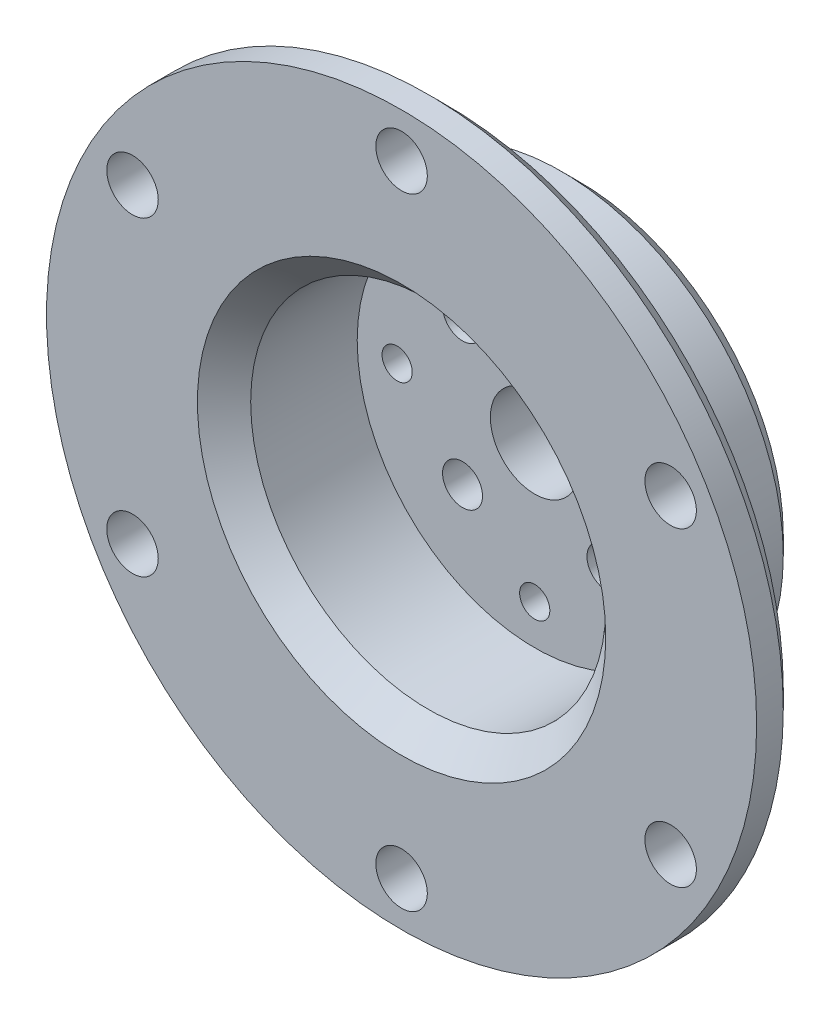
ISO-10303-21;
HEADER;
FILE_DESCRIPTION(('STEP AP214'),'2;1');
FILE_NAME('part.step','',(''),(''),'','','');
FILE_SCHEMA(('AUTOMOTIVE_DESIGN { 1 0 10303 214 1 1 1 1 }'));
ENDSEC;
DATA;
#1=APPLICATION_CONTEXT('core data for automotive mechanical design processes');
#2=APPLICATION_PROTOCOL_DEFINITION('international standard','automotive_design',2000,#1);
#3=PRODUCT_CONTEXT('',#1,'mechanical');
#4=PRODUCT('Part','Part','',(#3));
#5=PRODUCT_RELATED_PRODUCT_CATEGORY('part','',(#4));
#6=PRODUCT_DEFINITION_FORMATION('','',#4);
#7=PRODUCT_DEFINITION_CONTEXT('part definition',#1,'design');
#8=PRODUCT_DEFINITION('design','',#6,#7);
#9=PRODUCT_DEFINITION_SHAPE('','',#8);
#10=(LENGTH_UNIT() NAMED_UNIT(*) SI_UNIT(.MILLI.,.METRE.));
#11=(NAMED_UNIT(*) PLANE_ANGLE_UNIT() SI_UNIT($,.RADIAN.));
#12=(NAMED_UNIT(*) SI_UNIT($,.STERADIAN.) SOLID_ANGLE_UNIT());
#13=UNCERTAINTY_MEASURE_WITH_UNIT(LENGTH_MEASURE(1.E-05),#10,'distance_accuracy_value','');
#14=(GEOMETRIC_REPRESENTATION_CONTEXT(3) GLOBAL_UNCERTAINTY_ASSIGNED_CONTEXT((#13)) GLOBAL_UNIT_ASSIGNED_CONTEXT((#10,
#11,#12)) REPRESENTATION_CONTEXT('',''));
#15=CARTESIAN_POINT('',(0.,0.,0.));
#16=DIRECTION('',(0.,0.,1.));
#17=DIRECTION('',(1.,0.,0.));
#18=AXIS2_PLACEMENT_3D('',#15,#16,#17);
#19=CARTESIAN_POINT('',(0.,0.,5.));
#20=DIRECTION('',(0.,0.,1.));
#21=DIRECTION('',(1.,0.,0.));
#22=AXIS2_PLACEMENT_3D('',#19,#20,#21);
#23=PLANE('',#22);
#24=CARTESIAN_POINT('',(0.,0.,5.));
#25=DIRECTION('',(0.,0.,1.));
#26=DIRECTION('',(1.,0.,0.));
#27=AXIS2_PLACEMENT_3D('',#24,#25,#26);
#28=CIRCLE('',#27,20.);
#29=CARTESIAN_POINT('',(20.,0.,5.));
#30=VERTEX_POINT('',#29);
#31=EDGE_CURVE('E123',#30,#30,#28,.T.);
#32=ORIENTED_EDGE('',*,*,#31,.T.);
#33=EDGE_LOOP('',(#32));
#34=FACE_BOUND('',#33,.T.);
#35=CARTESIAN_POINT('',(8.1317279836453,8.13172798364529,5.));
#36=DIRECTION('',(0.,0.,1.));
#37=DIRECTION('',(1.,0.,0.));
#38=AXIS2_PLACEMENT_3D('',#35,#36,#37);
#39=CIRCLE('',#38,2.25);
#40=CARTESIAN_POINT('',(10.3817279836453,8.13172798364529,5.));
#41=VERTEX_POINT('',#40);
#42=EDGE_CURVE('E99',#41,#41,#39,.F.);
#43=ORIENTED_EDGE('',*,*,#42,.T.);
#44=EDGE_LOOP('',(#43));
#45=FACE_BOUND('',#44,.T.);
#46=CARTESIAN_POINT('',(15.5,0.,5.));
#47=DIRECTION('',(0.,0.,1.));
#48=DIRECTION('',(1.,0.,0.));
#49=AXIS2_PLACEMENT_3D('',#46,#47,#48);
#50=CIRCLE('',#49,1.7);
#51=CARTESIAN_POINT('',(17.2,0.,5.));
#52=VERTEX_POINT('',#51);
#53=EDGE_CURVE('E86',#52,#52,#50,.F.);
#54=ORIENTED_EDGE('',*,*,#53,.T.);
#55=EDGE_LOOP('',(#54));
#56=FACE_BOUND('',#55,.T.);
#57=CARTESIAN_POINT('',(0.,15.5,5.));
#58=DIRECTION('',(0.,0.,1.));
#59=DIRECTION('',(1.,0.,0.));
#60=AXIS2_PLACEMENT_3D('',#57,#58,#59);
#61=CIRCLE('',#60,1.7);
#62=CARTESIAN_POINT('',(1.70000000000003,15.5,5.));
#63=VERTEX_POINT('',#62);
#64=EDGE_CURVE('E92',#63,#63,#61,.F.);
#65=ORIENTED_EDGE('',*,*,#64,.T.);
#66=EDGE_LOOP('',(#65));
#67=FACE_BOUND('',#66,.T.);
#68=CARTESIAN_POINT('',(0.,-15.5,5.));
#69=DIRECTION('',(0.,0.,1.));
#70=DIRECTION('',(1.,0.,0.));
#71=AXIS2_PLACEMENT_3D('',#68,#69,#70);
#72=CIRCLE('',#71,1.7);
#73=CARTESIAN_POINT('',(1.69999999999997,-15.5,5.));
#74=VERTEX_POINT('',#73);
#75=EDGE_CURVE('E78',#74,#74,#72,.F.);
#76=ORIENTED_EDGE('',*,*,#75,.T.);
#77=EDGE_LOOP('',(#76));
#78=FACE_BOUND('',#77,.T.);
#79=CARTESIAN_POINT('',(-15.5,0.,5.));
#80=DIRECTION('',(0.,0.,1.));
#81=DIRECTION('',(1.,0.,0.));
#82=AXIS2_PLACEMENT_3D('',#79,#80,#81);
#83=CIRCLE('',#82,1.7);
#84=CARTESIAN_POINT('',(-13.8,0.,5.));
#85=VERTEX_POINT('',#84);
#86=EDGE_CURVE('E69',#85,#85,#83,.F.);
#87=ORIENTED_EDGE('',*,*,#86,.T.);
#88=EDGE_LOOP('',(#87));
#89=FACE_BOUND('',#88,.T.);
#90=CARTESIAN_POINT('',(8.1317279836453,-8.1317279836453,5.));
#91=DIRECTION('',(0.,0.,1.));
#92=DIRECTION('',(1.,0.,0.));
#93=AXIS2_PLACEMENT_3D('',#90,#91,#92);
#94=CIRCLE('',#93,2.25);
#95=CARTESIAN_POINT('',(10.3817279836453,-8.1317279836453,5.));
#96=VERTEX_POINT('',#95);
#97=EDGE_CURVE('E112',#96,#96,#94,.F.);
#98=ORIENTED_EDGE('',*,*,#97,.T.);
#99=EDGE_LOOP('',(#98));
#100=FACE_BOUND('',#99,.T.);
#101=CARTESIAN_POINT('',(-8.13172798364529,-8.1317279836453,5.));
#102=DIRECTION('',(0.,0.,1.));
#103=DIRECTION('',(1.,0.,0.));
#104=AXIS2_PLACEMENT_3D('',#101,#102,#103);
#105=CIRCLE('',#104,2.25);
#106=CARTESIAN_POINT('',(-5.88172798364529,-8.1317279836453,5.));
#107=VERTEX_POINT('',#106);
#108=EDGE_CURVE('E106',#107,#107,#105,.F.);
#109=ORIENTED_EDGE('',*,*,#108,.T.);
#110=EDGE_LOOP('',(#109));
#111=FACE_BOUND('',#110,.T.);
#112=CARTESIAN_POINT('',(-8.13172798364529,8.13172798364529,5.));
#113=DIRECTION('',(0.,0.,1.));
#114=DIRECTION('',(1.,0.,0.));
#115=AXIS2_PLACEMENT_3D('',#112,#113,#114);
#116=CIRCLE('',#115,2.25);
#117=CARTESIAN_POINT('',(-5.88172798364529,8.13172798364529,5.));
#118=VERTEX_POINT('',#117);
#119=EDGE_CURVE('E100',#118,#118,#116,.F.);
#120=ORIENTED_EDGE('',*,*,#119,.T.);
#121=EDGE_LOOP('',(#120));
#122=FACE_BOUND('',#121,.T.);
#123=CARTESIAN_POINT('',(0.,0.,5.));
#124=DIRECTION('',(0.,0.,1.));
#125=DIRECTION('',(1.,0.,0.));
#126=AXIS2_PLACEMENT_3D('',#123,#124,#125);
#127=CIRCLE('',#126,5.);
#128=CARTESIAN_POINT('',(5.,0.,5.));
#129=VERTEX_POINT('',#128);
#130=EDGE_CURVE('E85',#129,#129,#127,.F.);
#131=ORIENTED_EDGE('',*,*,#130,.T.);
#132=EDGE_LOOP('',(#131));
#133=FACE_BOUND('',#132,.T.);
#134=ADVANCED_FACE('F35',(#34,#45,#56,#67,#78,#89,#100,#111,#122,#133),#23,.T.);
#135=CARTESIAN_POINT('',(0.,0.,0.));
#136=DIRECTION('',(0.,0.,1.));
#137=DIRECTION('',(1.,0.,0.));
#138=AXIS2_PLACEMENT_3D('',#135,#136,#137);
#139=CYLINDRICAL_SURFACE('',#138,20.);
#140=CARTESIAN_POINT('',(0.,0.,17.));
#141=DIRECTION('',(0.,0.,1.));
#142=DIRECTION('',(1.,0.,0.));
#143=AXIS2_PLACEMENT_3D('',#140,#141,#142);
#144=CIRCLE('',#143,20.);
#145=CARTESIAN_POINT('',(20.,0.,17.));
#146=VERTEX_POINT('',#145);
#147=EDGE_CURVE('E10',#146,#146,#144,.T.);
#148=ORIENTED_EDGE('',*,*,#147,.T.);
#149=EDGE_LOOP('',(#148));
#150=FACE_BOUND('',#149,.T.);
#151=ORIENTED_EDGE('',*,*,#31,.F.);
#152=EDGE_LOOP('',(#151));
#153=FACE_BOUND('',#152,.T.);
#154=ADVANCED_FACE('F37',(#150,#153),#139,.F.);
#155=CARTESIAN_POINT('',(0.,0.,17.));
#156=DIRECTION('',(0.,0.,1.));
#157=DIRECTION('',(1.,0.,0.));
#158=AXIS2_PLACEMENT_3D('',#155,#156,#157);
#159=CONICAL_SURFACE('',#158,20.,0.785398163397448);
#160=CARTESIAN_POINT('',(0.,0.,20.));
#161=DIRECTION('',(0.,0.,1.));
#162=DIRECTION('',(1.,0.,0.));
#163=AXIS2_PLACEMENT_3D('',#160,#161,#162);
#164=CIRCLE('',#163,23.);
#165=CARTESIAN_POINT('',(23.,0.,20.));
#166=VERTEX_POINT('',#165);
#167=EDGE_CURVE('E43',#166,#166,#164,.T.);
#168=ORIENTED_EDGE('',*,*,#167,.T.);
#169=EDGE_LOOP('',(#168));
#170=FACE_BOUND('',#169,.T.);
#171=ORIENTED_EDGE('',*,*,#147,.F.);
#172=EDGE_LOOP('',(#171));
#173=FACE_BOUND('',#172,.T.);
#174=ADVANCED_FACE('F160',(#170,#173),#159,.F.);
#175=CARTESIAN_POINT('',(23.,0.,20.));
#176=DIRECTION('',(0.,0.,1.));
#177=DIRECTION('',(1.,0.,0.));
#178=AXIS2_PLACEMENT_3D('',#175,#176,#177);
#179=PLANE('',#178);
#180=CARTESIAN_POINT('',(30.3108891324553,-17.5,20.));
#181=DIRECTION('',(0.,0.,1.));
#182=DIRECTION('',(1.,0.,0.));
#183=AXIS2_PLACEMENT_3D('',#180,#181,#182);
#184=CIRCLE('',#183,2.9);
#185=CARTESIAN_POINT('',(33.2108891324553,-17.5,20.));
#186=VERTEX_POINT('',#185);
#187=EDGE_CURVE('E318',#186,#186,#184,.T.);
#188=ORIENTED_EDGE('',*,*,#187,.F.);
#189=EDGE_LOOP('',(#188));
#190=FACE_BOUND('',#189,.T.);
#191=CARTESIAN_POINT('',(0.,-35.,20.));
#192=DIRECTION('',(0.,0.,1.));
#193=DIRECTION('',(1.,0.,0.));
#194=AXIS2_PLACEMENT_3D('',#191,#192,#193);
#195=CIRCLE('',#194,2.9);
#196=CARTESIAN_POINT('',(2.89999999999999,-35.,20.));
#197=VERTEX_POINT('',#196);
#198=EDGE_CURVE('E321',#197,#197,#195,.T.);
#199=ORIENTED_EDGE('',*,*,#198,.F.);
#200=EDGE_LOOP('',(#199));
#201=FACE_BOUND('',#200,.T.);
#202=CARTESIAN_POINT('',(-30.3108891324554,-17.5,20.));
#203=DIRECTION('',(0.,0.,1.));
#204=DIRECTION('',(1.,0.,0.));
#205=AXIS2_PLACEMENT_3D('',#202,#203,#204);
#206=CIRCLE('',#205,2.9);
#207=CARTESIAN_POINT('',(-27.4108891324554,-17.5,20.));
#208=VERTEX_POINT('',#207);
#209=EDGE_CURVE('E219',#208,#208,#206,.T.);
#210=ORIENTED_EDGE('',*,*,#209,.F.);
#211=EDGE_LOOP('',(#210));
#212=FACE_BOUND('',#211,.T.);
#213=CARTESIAN_POINT('',(0.,35.,20.));
#214=DIRECTION('',(0.,0.,1.));
#215=DIRECTION('',(1.,0.,0.));
#216=AXIS2_PLACEMENT_3D('',#213,#214,#215);
#217=CIRCLE('',#216,2.9);
#218=CARTESIAN_POINT('',(2.89999999999999,35.,20.));
#219=VERTEX_POINT('',#218);
#220=EDGE_CURVE('E216',#219,#219,#217,.T.);
#221=ORIENTED_EDGE('',*,*,#220,.F.);
#222=EDGE_LOOP('',(#221));
#223=FACE_BOUND('',#222,.T.);
#224=CARTESIAN_POINT('',(30.3108891324553,17.5,20.));
#225=DIRECTION('',(0.,0.,1.));
#226=DIRECTION('',(1.,0.,0.));
#227=AXIS2_PLACEMENT_3D('',#224,#225,#226);
#228=CIRCLE('',#227,2.9);
#229=CARTESIAN_POINT('',(33.2108891324553,17.5,20.));
#230=VERTEX_POINT('',#229);
#231=EDGE_CURVE('E316',#230,#230,#228,.T.);
#232=ORIENTED_EDGE('',*,*,#231,.F.);
#233=EDGE_LOOP('',(#232));
#234=FACE_BOUND('',#233,.T.);
#235=CARTESIAN_POINT('',(-30.3108891324554,17.5,20.));
#236=DIRECTION('',(0.,0.,1.));
#237=DIRECTION('',(1.,0.,0.));
#238=AXIS2_PLACEMENT_3D('',#235,#236,#237);
#239=CIRCLE('',#238,2.9);
#240=CARTESIAN_POINT('',(-27.4108891324554,17.5,20.));
#241=VERTEX_POINT('',#240);
#242=EDGE_CURVE('E56',#241,#241,#239,.T.);
#243=ORIENTED_EDGE('',*,*,#242,.F.);
#244=EDGE_LOOP('',(#243));
#245=FACE_BOUND('',#244,.T.);
#246=CARTESIAN_POINT('',(0.,0.,20.));
#247=DIRECTION('',(0.,0.,1.));
#248=DIRECTION('',(1.,0.,0.));
#249=AXIS2_PLACEMENT_3D('',#246,#247,#248);
#250=CIRCLE('',#249,40.);
#251=CARTESIAN_POINT('',(40.,0.,20.));
#252=VERTEX_POINT('',#251);
#253=EDGE_CURVE('E48',#252,#252,#250,.T.);
#254=ORIENTED_EDGE('',*,*,#253,.T.);
#255=EDGE_LOOP('',(#254));
#256=FACE_BOUND('',#255,.T.);
#257=ORIENTED_EDGE('',*,*,#167,.F.);
#258=EDGE_LOOP('',(#257));
#259=FACE_BOUND('',#258,.T.);
#260=ADVANCED_FACE('F145',(#190,#201,#212,#223,#234,#245,#256,#259),#179,.T.);
#261=CARTESIAN_POINT('',(0.,0.,0.));
#262=DIRECTION('',(0.,0.,1.));
#263=DIRECTION('',(1.,0.,0.));
#264=AXIS2_PLACEMENT_3D('',#261,#262,#263);
#265=CYLINDRICAL_SURFACE('',#264,40.);
#266=CARTESIAN_POINT('',(0.,0.,17.));
#267=DIRECTION('',(0.,0.,1.));
#268=DIRECTION('',(1.,0.,0.));
#269=AXIS2_PLACEMENT_3D('',#266,#267,#268);
#270=CIRCLE('',#269,40.);
#271=CARTESIAN_POINT('',(40.,0.,17.));
#272=VERTEX_POINT('',#271);
#273=EDGE_CURVE('E140',#272,#272,#270,.T.);
#274=ORIENTED_EDGE('',*,*,#273,.T.);
#275=EDGE_LOOP('',(#274));
#276=FACE_BOUND('',#275,.T.);
#277=ORIENTED_EDGE('',*,*,#253,.F.);
#278=EDGE_LOOP('',(#277));
#279=FACE_BOUND('',#278,.T.);
#280=ADVANCED_FACE('F148',(#276,#279),#265,.T.);
#281=CARTESIAN_POINT('',(0.,0.,17.));
#282=DIRECTION('',(0.,0.,1.));
#283=DIRECTION('',(1.,0.,0.));
#284=AXIS2_PLACEMENT_3D('',#281,#282,#283);
#285=CONICAL_SURFACE('',#284,40.,0.785398163397448);
#286=CARTESIAN_POINT('',(0.,0.,15.));
#287=DIRECTION('',(0.,0.,1.));
#288=DIRECTION('',(1.,0.,0.));
#289=AXIS2_PLACEMENT_3D('',#286,#287,#288);
#290=CIRCLE('',#289,38.);
#291=CARTESIAN_POINT('',(38.,0.,15.));
#292=VERTEX_POINT('',#291);
#293=EDGE_CURVE('E137',#292,#292,#290,.T.);
#294=ORIENTED_EDGE('',*,*,#293,.T.);
#295=EDGE_LOOP('',(#294));
#296=FACE_BOUND('',#295,.T.);
#297=ORIENTED_EDGE('',*,*,#273,.F.);
#298=EDGE_LOOP('',(#297));
#299=FACE_BOUND('',#298,.T.);
#300=ADVANCED_FACE('F150',(#296,#299),#285,.T.);
#301=CARTESIAN_POINT('',(38.,0.,15.));
#302=DIRECTION('',(0.,0.,-1.));
#303=DIRECTION('',(-1.,0.,0.));
#304=AXIS2_PLACEMENT_3D('',#301,#302,#303);
#305=PLANE('',#304);
#306=CARTESIAN_POINT('',(30.3108891324553,-17.5,15.));
#307=DIRECTION('',(0.,0.,-1.));
#308=DIRECTION('',(-1.,0.,0.));
#309=AXIS2_PLACEMENT_3D('',#306,#307,#308);
#310=CIRCLE('',#309,2.9);
#311=CARTESIAN_POINT('',(27.4108891324553,-17.5,15.));
#312=VERTEX_POINT('',#311);
#313=EDGE_CURVE('E39',#312,#312,#310,.T.);
#314=ORIENTED_EDGE('',*,*,#313,.F.);
#315=EDGE_LOOP('',(#314));
#316=FACE_BOUND('',#315,.T.);
#317=CARTESIAN_POINT('',(0.,-35.,15.));
#318=DIRECTION('',(0.,0.,-1.));
#319=DIRECTION('',(-1.,0.,0.));
#320=AXIS2_PLACEMENT_3D('',#317,#318,#319);
#321=CIRCLE('',#320,2.9);
#322=CARTESIAN_POINT('',(-2.90000000000001,-35.,15.));
#323=VERTEX_POINT('',#322);
#324=EDGE_CURVE('E64',#323,#323,#321,.T.);
#325=ORIENTED_EDGE('',*,*,#324,.F.);
#326=EDGE_LOOP('',(#325));
#327=FACE_BOUND('',#326,.T.);
#328=CARTESIAN_POINT('',(-30.3108891324554,-17.5,15.));
#329=DIRECTION('',(0.,0.,-1.));
#330=DIRECTION('',(-1.,0.,0.));
#331=AXIS2_PLACEMENT_3D('',#328,#329,#330);
#332=CIRCLE('',#331,2.9);
#333=CARTESIAN_POINT('',(-33.2108891324554,-17.5,15.));
#334=VERTEX_POINT('',#333);
#335=EDGE_CURVE('E62',#334,#334,#332,.T.);
#336=ORIENTED_EDGE('',*,*,#335,.F.);
#337=EDGE_LOOP('',(#336));
#338=FACE_BOUND('',#337,.T.);
#339=CARTESIAN_POINT('',(0.,35.,15.));
#340=DIRECTION('',(0.,0.,-1.));
#341=DIRECTION('',(-1.,0.,0.));
#342=AXIS2_PLACEMENT_3D('',#339,#340,#341);
#343=CIRCLE('',#342,2.9);
#344=CARTESIAN_POINT('',(-2.90000000000001,35.,15.));
#345=VERTEX_POINT('',#344);
#346=EDGE_CURVE('E59',#345,#345,#343,.T.);
#347=ORIENTED_EDGE('',*,*,#346,.F.);
#348=EDGE_LOOP('',(#347));
#349=FACE_BOUND('',#348,.T.);
#350=CARTESIAN_POINT('',(30.3108891324553,17.5,15.));
#351=DIRECTION('',(0.,0.,-1.));
#352=DIRECTION('',(-1.,0.,0.));
#353=AXIS2_PLACEMENT_3D('',#350,#351,#352);
#354=CIRCLE('',#353,2.9);
#355=CARTESIAN_POINT('',(27.4108891324553,17.5,15.));
#356=VERTEX_POINT('',#355);
#357=EDGE_CURVE('E55',#356,#356,#354,.T.);
#358=ORIENTED_EDGE('',*,*,#357,.F.);
#359=EDGE_LOOP('',(#358));
#360=FACE_BOUND('',#359,.T.);
#361=CARTESIAN_POINT('',(-30.3108891324554,17.5,15.));
#362=DIRECTION('',(0.,0.,-1.));
#363=DIRECTION('',(-1.,0.,0.));
#364=AXIS2_PLACEMENT_3D('',#361,#362,#363);
#365=CIRCLE('',#364,2.9);
#366=CARTESIAN_POINT('',(-33.2108891324554,17.5,15.));
#367=VERTEX_POINT('',#366);
#368=EDGE_CURVE('E52',#367,#367,#365,.T.);
#369=ORIENTED_EDGE('',*,*,#368,.F.);
#370=EDGE_LOOP('',(#369));
#371=FACE_BOUND('',#370,.T.);
#372=CARTESIAN_POINT('',(0.,0.,15.));
#373=DIRECTION('',(0.,0.,1.));
#374=DIRECTION('',(1.,0.,0.));
#375=AXIS2_PLACEMENT_3D('',#372,#373,#374);
#376=CIRCLE('',#375,25.);
#377=CARTESIAN_POINT('',(25.,0.,15.));
#378=VERTEX_POINT('',#377);
#379=EDGE_CURVE('E134',#378,#378,#376,.T.);
#380=ORIENTED_EDGE('',*,*,#379,.T.);
#381=EDGE_LOOP('',(#380));
#382=FACE_BOUND('',#381,.T.);
#383=ORIENTED_EDGE('',*,*,#293,.F.);
#384=EDGE_LOOP('',(#383));
#385=FACE_BOUND('',#384,.T.);
#386=ADVANCED_FACE('F157',(#316,#327,#338,#349,#360,#371,#382,#385),#305,.T.);
#387=CARTESIAN_POINT('',(0.,0.,0.));
#388=DIRECTION('',(0.,0.,1.));
#389=DIRECTION('',(1.,0.,0.));
#390=AXIS2_PLACEMENT_3D('',#387,#388,#389);
#391=CYLINDRICAL_SURFACE('',#390,25.);
#392=CARTESIAN_POINT('',(0.,0.,2.));
#393=DIRECTION('',(0.,0.,1.));
#394=DIRECTION('',(1.,0.,0.));
#395=AXIS2_PLACEMENT_3D('',#392,#393,#394);
#396=CIRCLE('',#395,25.);
#397=CARTESIAN_POINT('',(25.,0.,2.));
#398=VERTEX_POINT('',#397);
#399=EDGE_CURVE('E131',#398,#398,#396,.T.);
#400=ORIENTED_EDGE('',*,*,#399,.T.);
#401=EDGE_LOOP('',(#400));
#402=FACE_BOUND('',#401,.T.);
#403=ORIENTED_EDGE('',*,*,#379,.F.);
#404=EDGE_LOOP('',(#403));
#405=FACE_BOUND('',#404,.T.);
#406=ADVANCED_FACE('F181',(#402,#405),#391,.T.);
#407=CARTESIAN_POINT('',(0.,0.,2.));
#408=DIRECTION('',(0.,0.,1.));
#409=DIRECTION('',(1.,0.,0.));
#410=AXIS2_PLACEMENT_3D('',#407,#408,#409);
#411=CONICAL_SURFACE('',#410,25.,0.785398163397449);
#412=CARTESIAN_POINT('',(0.,0.,0.));
#413=DIRECTION('',(0.,0.,1.));
#414=DIRECTION('',(1.,0.,0.));
#415=AXIS2_PLACEMENT_3D('',#412,#413,#414);
#416=CIRCLE('',#415,23.);
#417=CARTESIAN_POINT('',(23.,0.,0.));
#418=VERTEX_POINT('',#417);
#419=EDGE_CURVE('E128',#418,#418,#416,.T.);
#420=ORIENTED_EDGE('',*,*,#419,.T.);
#421=EDGE_LOOP('',(#420));
#422=FACE_BOUND('',#421,.T.);
#423=ORIENTED_EDGE('',*,*,#399,.F.);
#424=EDGE_LOOP('',(#423));
#425=FACE_BOUND('',#424,.T.);
#426=ADVANCED_FACE('F177',(#422,#425),#411,.T.);
#427=CARTESIAN_POINT('',(23.,0.,0.));
#428=DIRECTION('',(0.,0.,-1.));
#429=DIRECTION('',(-1.,0.,0.));
#430=AXIS2_PLACEMENT_3D('',#427,#428,#429);
#431=PLANE('',#430);
#432=CARTESIAN_POINT('',(-8.13172798364529,8.13172798364529,0.));
#433=DIRECTION('',(0.,0.,-1.));
#434=DIRECTION('',(-1.,0.,0.));
#435=AXIS2_PLACEMENT_3D('',#432,#433,#434);
#436=CIRCLE('',#435,2.25);
#437=CARTESIAN_POINT('',(-10.3817279836453,8.13172798364529,0.));
#438=VERTEX_POINT('',#437);
#439=EDGE_CURVE('E96',#438,#438,#436,.T.);
#440=ORIENTED_EDGE('',*,*,#439,.F.);
#441=EDGE_LOOP('',(#440));
#442=FACE_BOUND('',#441,.T.);
#443=CARTESIAN_POINT('',(-8.13172798364529,-8.1317279836453,0.));
#444=DIRECTION('',(0.,0.,-1.));
#445=DIRECTION('',(-1.,0.,0.));
#446=AXIS2_PLACEMENT_3D('',#443,#444,#445);
#447=CIRCLE('',#446,2.25);
#448=CARTESIAN_POINT('',(-10.3817279836453,-8.1317279836453,0.));
#449=VERTEX_POINT('',#448);
#450=EDGE_CURVE('E103',#449,#449,#447,.T.);
#451=ORIENTED_EDGE('',*,*,#450,.F.);
#452=EDGE_LOOP('',(#451));
#453=FACE_BOUND('',#452,.T.);
#454=CARTESIAN_POINT('',(8.1317279836453,-8.1317279836453,0.));
#455=DIRECTION('',(0.,0.,-1.));
#456=DIRECTION('',(-1.,0.,0.));
#457=AXIS2_PLACEMENT_3D('',#454,#455,#456);
#458=CIRCLE('',#457,2.25);
#459=CARTESIAN_POINT('',(5.8817279836453,-8.1317279836453,0.));
#460=VERTEX_POINT('',#459);
#461=EDGE_CURVE('E109',#460,#460,#458,.T.);
#462=ORIENTED_EDGE('',*,*,#461,.F.);
#463=EDGE_LOOP('',(#462));
#464=FACE_BOUND('',#463,.T.);
#465=CARTESIAN_POINT('',(0.,0.,0.));
#466=DIRECTION('',(0.,0.,-1.));
#467=DIRECTION('',(-1.,0.,0.));
#468=AXIS2_PLACEMENT_3D('',#465,#466,#467);
#469=CIRCLE('',#468,5.);
#470=CARTESIAN_POINT('',(-5.,0.,0.));
#471=VERTEX_POINT('',#470);
#472=EDGE_CURVE('E115',#471,#471,#469,.T.);
#473=ORIENTED_EDGE('',*,*,#472,.F.);
#474=EDGE_LOOP('',(#473));
#475=FACE_BOUND('',#474,.T.);
#476=CARTESIAN_POINT('',(-15.5,0.,0.));
#477=DIRECTION('',(0.,0.,-1.));
#478=DIRECTION('',(-1.,0.,0.));
#479=AXIS2_PLACEMENT_3D('',#476,#477,#478);
#480=CIRCLE('',#479,1.7);
#481=CARTESIAN_POINT('',(-17.2,0.,0.));
#482=VERTEX_POINT('',#481);
#483=EDGE_CURVE('E73',#482,#482,#480,.T.);
#484=ORIENTED_EDGE('',*,*,#483,.F.);
#485=EDGE_LOOP('',(#484));
#486=FACE_BOUND('',#485,.T.);
#487=CARTESIAN_POINT('',(0.,-15.5,0.));
#488=DIRECTION('',(0.,0.,-1.));
#489=DIRECTION('',(-1.,0.,0.));
#490=AXIS2_PLACEMENT_3D('',#487,#488,#489);
#491=CIRCLE('',#490,1.7);
#492=CARTESIAN_POINT('',(-1.70000000000003,-15.5,0.));
#493=VERTEX_POINT('',#492);
#494=EDGE_CURVE('E95',#493,#493,#491,.T.);
#495=ORIENTED_EDGE('',*,*,#494,.F.);
#496=EDGE_LOOP('',(#495));
#497=FACE_BOUND('',#496,.T.);
#498=CARTESIAN_POINT('',(0.,15.5,0.));
#499=DIRECTION('',(0.,0.,-1.));
#500=DIRECTION('',(-1.,0.,0.));
#501=AXIS2_PLACEMENT_3D('',#498,#499,#500);
#502=CIRCLE('',#501,1.7);
#503=CARTESIAN_POINT('',(-1.69999999999997,15.5,0.));
#504=VERTEX_POINT('',#503);
#505=EDGE_CURVE('E89',#504,#504,#502,.T.);
#506=ORIENTED_EDGE('',*,*,#505,.F.);
#507=EDGE_LOOP('',(#506));
#508=FACE_BOUND('',#507,.T.);
#509=CARTESIAN_POINT('',(15.5,0.,0.));
#510=DIRECTION('',(0.,0.,-1.));
#511=DIRECTION('',(-1.,0.,0.));
#512=AXIS2_PLACEMENT_3D('',#509,#510,#511);
#513=CIRCLE('',#512,1.7);
#514=CARTESIAN_POINT('',(13.8,0.,0.));
#515=VERTEX_POINT('',#514);
#516=EDGE_CURVE('E82',#515,#515,#513,.T.);
#517=ORIENTED_EDGE('',*,*,#516,.F.);
#518=EDGE_LOOP('',(#517));
#519=FACE_BOUND('',#518,.T.);
#520=CARTESIAN_POINT('',(8.1317279836453,8.13172798364529,0.));
#521=DIRECTION('',(0.,0.,-1.));
#522=DIRECTION('',(-1.,0.,0.));
#523=AXIS2_PLACEMENT_3D('',#520,#521,#522);
#524=CIRCLE('',#523,2.25);
#525=CARTESIAN_POINT('',(5.8817279836453,8.13172798364529,0.));
#526=VERTEX_POINT('',#525);
#527=EDGE_CURVE('E120',#526,#526,#524,.T.);
#528=ORIENTED_EDGE('',*,*,#527,.F.);
#529=EDGE_LOOP('',(#528));
#530=FACE_BOUND('',#529,.T.);
#531=ORIENTED_EDGE('',*,*,#419,.F.);
#532=EDGE_LOOP('',(#531));
#533=FACE_BOUND('',#532,.T.);
#534=ADVANCED_FACE('F174',(#442,#453,#464,#475,#486,#497,#508,#519,#530,#533),#431,.T.);
#535=CARTESIAN_POINT('',(8.1317279836453,8.13172798364529,20.001));
#536=DIRECTION('',(0.,0.,-1.));
#537=DIRECTION('',(-1.,0.,0.));
#538=AXIS2_PLACEMENT_3D('',#535,#536,#537);
#539=CYLINDRICAL_SURFACE('',#538,2.25);
#540=ORIENTED_EDGE('',*,*,#42,.F.);
#541=EDGE_LOOP('',(#540));
#542=FACE_BOUND('',#541,.T.);
#543=ORIENTED_EDGE('',*,*,#527,.T.);
#544=EDGE_LOOP('',(#543));
#545=FACE_BOUND('',#544,.T.);
#546=ADVANCED_FACE('F172',(#542,#545),#539,.F.);
#547=CARTESIAN_POINT('',(15.5,0.,20.001));
#548=DIRECTION('',(0.,0.,-1.));
#549=DIRECTION('',(-1.,0.,0.));
#550=AXIS2_PLACEMENT_3D('',#547,#548,#549);
#551=CYLINDRICAL_SURFACE('',#550,1.7);
#552=ORIENTED_EDGE('',*,*,#53,.F.);
#553=EDGE_LOOP('',(#552));
#554=FACE_BOUND('',#553,.T.);
#555=ORIENTED_EDGE('',*,*,#516,.T.);
#556=EDGE_LOOP('',(#555));
#557=FACE_BOUND('',#556,.T.);
#558=ADVANCED_FACE('F248',(#554,#557),#551,.F.);
#559=CARTESIAN_POINT('',(0.,15.5,20.001));
#560=DIRECTION('',(0.,0.,-1.));
#561=DIRECTION('',(-1.,0.,0.));
#562=AXIS2_PLACEMENT_3D('',#559,#560,#561);
#563=CYLINDRICAL_SURFACE('',#562,1.7);
#564=ORIENTED_EDGE('',*,*,#64,.F.);
#565=EDGE_LOOP('',(#564));
#566=FACE_BOUND('',#565,.T.);
#567=ORIENTED_EDGE('',*,*,#505,.T.);
#568=EDGE_LOOP('',(#567));
#569=FACE_BOUND('',#568,.T.);
#570=ADVANCED_FACE('F232',(#566,#569),#563,.F.);
#571=CARTESIAN_POINT('',(0.,-15.5,20.001));
#572=DIRECTION('',(0.,0.,-1.));
#573=DIRECTION('',(-1.,0.,0.));
#574=AXIS2_PLACEMENT_3D('',#571,#572,#573);
#575=CYLINDRICAL_SURFACE('',#574,1.7);
#576=ORIENTED_EDGE('',*,*,#75,.F.);
#577=EDGE_LOOP('',(#576));
#578=FACE_BOUND('',#577,.T.);
#579=ORIENTED_EDGE('',*,*,#494,.T.);
#580=EDGE_LOOP('',(#579));
#581=FACE_BOUND('',#580,.T.);
#582=ADVANCED_FACE('F228',(#578,#581),#575,.F.);
#583=CARTESIAN_POINT('',(-15.5,0.,20.001));
#584=DIRECTION('',(0.,0.,-1.));
#585=DIRECTION('',(-1.,0.,0.));
#586=AXIS2_PLACEMENT_3D('',#583,#584,#585);
#587=CYLINDRICAL_SURFACE('',#586,1.7);
#588=ORIENTED_EDGE('',*,*,#86,.F.);
#589=EDGE_LOOP('',(#588));
#590=FACE_BOUND('',#589,.T.);
#591=ORIENTED_EDGE('',*,*,#483,.T.);
#592=EDGE_LOOP('',(#591));
#593=FACE_BOUND('',#592,.T.);
#594=ADVANCED_FACE('F231',(#590,#593),#587,.F.);
#595=CARTESIAN_POINT('',(8.1317279836453,-8.1317279836453,20.001));
#596=DIRECTION('',(0.,0.,-1.));
#597=DIRECTION('',(-1.,0.,0.));
#598=AXIS2_PLACEMENT_3D('',#595,#596,#597);
#599=CYLINDRICAL_SURFACE('',#598,2.25);
#600=ORIENTED_EDGE('',*,*,#97,.F.);
#601=EDGE_LOOP('',(#600));
#602=FACE_BOUND('',#601,.T.);
#603=ORIENTED_EDGE('',*,*,#461,.T.);
#604=EDGE_LOOP('',(#603));
#605=FACE_BOUND('',#604,.T.);
#606=ADVANCED_FACE('F275',(#602,#605),#599,.F.);
#607=CARTESIAN_POINT('',(-8.13172798364529,-8.1317279836453,20.001));
#608=DIRECTION('',(0.,0.,-1.));
#609=DIRECTION('',(-1.,0.,0.));
#610=AXIS2_PLACEMENT_3D('',#607,#608,#609);
#611=CYLINDRICAL_SURFACE('',#610,2.25);
#612=ORIENTED_EDGE('',*,*,#108,.F.);
#613=EDGE_LOOP('',(#612));
#614=FACE_BOUND('',#613,.T.);
#615=ORIENTED_EDGE('',*,*,#450,.T.);
#616=EDGE_LOOP('',(#615));
#617=FACE_BOUND('',#616,.T.);
#618=ADVANCED_FACE('F271',(#614,#617),#611,.F.);
#619=CARTESIAN_POINT('',(-8.13172798364529,8.13172798364529,20.001));
#620=DIRECTION('',(0.,0.,-1.));
#621=DIRECTION('',(-1.,0.,0.));
#622=AXIS2_PLACEMENT_3D('',#619,#620,#621);
#623=CYLINDRICAL_SURFACE('',#622,2.25);
#624=ORIENTED_EDGE('',*,*,#119,.F.);
#625=EDGE_LOOP('',(#624));
#626=FACE_BOUND('',#625,.T.);
#627=ORIENTED_EDGE('',*,*,#439,.T.);
#628=EDGE_LOOP('',(#627));
#629=FACE_BOUND('',#628,.T.);
#630=ADVANCED_FACE('F268',(#626,#629),#623,.F.);
#631=CARTESIAN_POINT('',(0.,0.,20.001));
#632=DIRECTION('',(0.,0.,-1.));
#633=DIRECTION('',(-1.,0.,0.));
#634=AXIS2_PLACEMENT_3D('',#631,#632,#633);
#635=CYLINDRICAL_SURFACE('',#634,5.);
#636=ORIENTED_EDGE('',*,*,#130,.F.);
#637=EDGE_LOOP('',(#636));
#638=FACE_BOUND('',#637,.T.);
#639=ORIENTED_EDGE('',*,*,#472,.T.);
#640=EDGE_LOOP('',(#639));
#641=FACE_BOUND('',#640,.T.);
#642=ADVANCED_FACE('F211',(#638,#641),#635,.F.);
#643=CARTESIAN_POINT('',(-30.3108891324554,17.5,10.));
#644=DIRECTION('',(0.,0.,1.));
#645=DIRECTION('',(1.,0.,0.));
#646=AXIS2_PLACEMENT_3D('',#643,#644,#645);
#647=CYLINDRICAL_SURFACE('',#646,2.9);
#648=ORIENTED_EDGE('',*,*,#368,.T.);
#649=EDGE_LOOP('',(#648));
#650=FACE_BOUND('',#649,.T.);
#651=ORIENTED_EDGE('',*,*,#242,.T.);
#652=EDGE_LOOP('',(#651));
#653=FACE_BOUND('',#652,.T.);
#654=ADVANCED_FACE('F207',(#650,#653),#647,.F.);
#655=CARTESIAN_POINT('',(30.3108891324553,17.5,10.));
#656=DIRECTION('',(0.,0.,1.));
#657=DIRECTION('',(1.,0.,0.));
#658=AXIS2_PLACEMENT_3D('',#655,#656,#657);
#659=CYLINDRICAL_SURFACE('',#658,2.9);
#660=ORIENTED_EDGE('',*,*,#357,.T.);
#661=EDGE_LOOP('',(#660));
#662=FACE_BOUND('',#661,.T.);
#663=ORIENTED_EDGE('',*,*,#231,.T.);
#664=EDGE_LOOP('',(#663));
#665=FACE_BOUND('',#664,.T.);
#666=ADVANCED_FACE('F210',(#662,#665),#659,.F.);
#667=CARTESIAN_POINT('',(0.,35.,10.));
#668=DIRECTION('',(0.,0.,1.));
#669=DIRECTION('',(1.,0.,0.));
#670=AXIS2_PLACEMENT_3D('',#667,#668,#669);
#671=CYLINDRICAL_SURFACE('',#670,2.9);
#672=ORIENTED_EDGE('',*,*,#346,.T.);
#673=EDGE_LOOP('',(#672));
#674=FACE_BOUND('',#673,.T.);
#675=ORIENTED_EDGE('',*,*,#220,.T.);
#676=EDGE_LOOP('',(#675));
#677=FACE_BOUND('',#676,.T.);
#678=ADVANCED_FACE('F299',(#674,#677),#671,.F.);
#679=CARTESIAN_POINT('',(-30.3108891324554,-17.5,10.));
#680=DIRECTION('',(0.,0.,1.));
#681=DIRECTION('',(1.,0.,0.));
#682=AXIS2_PLACEMENT_3D('',#679,#680,#681);
#683=CYLINDRICAL_SURFACE('',#682,2.9);
#684=ORIENTED_EDGE('',*,*,#335,.T.);
#685=EDGE_LOOP('',(#684));
#686=FACE_BOUND('',#685,.T.);
#687=ORIENTED_EDGE('',*,*,#209,.T.);
#688=EDGE_LOOP('',(#687));
#689=FACE_BOUND('',#688,.T.);
#690=ADVANCED_FACE('F295',(#686,#689),#683,.F.);
#691=CARTESIAN_POINT('',(0.,-35.,10.));
#692=DIRECTION('',(0.,0.,1.));
#693=DIRECTION('',(1.,0.,0.));
#694=AXIS2_PLACEMENT_3D('',#691,#692,#693);
#695=CYLINDRICAL_SURFACE('',#694,2.9);
#696=ORIENTED_EDGE('',*,*,#324,.T.);
#697=EDGE_LOOP('',(#696));
#698=FACE_BOUND('',#697,.T.);
#699=ORIENTED_EDGE('',*,*,#198,.T.);
#700=EDGE_LOOP('',(#699));
#701=FACE_BOUND('',#700,.T.);
#702=ADVANCED_FACE('F298',(#698,#701),#695,.F.);
#703=CARTESIAN_POINT('',(30.3108891324553,-17.5,10.));
#704=DIRECTION('',(0.,0.,1.));
#705=DIRECTION('',(1.,0.,0.));
#706=AXIS2_PLACEMENT_3D('',#703,#704,#705);
#707=CYLINDRICAL_SURFACE('',#706,2.9);
#708=ORIENTED_EDGE('',*,*,#313,.T.);
#709=EDGE_LOOP('',(#708));
#710=FACE_BOUND('',#709,.T.);
#711=ORIENTED_EDGE('',*,*,#187,.T.);
#712=EDGE_LOOP('',(#711));
#713=FACE_BOUND('',#712,.T.);
#714=ADVANCED_FACE('F304',(#710,#713),#707,.F.);
#715=CLOSED_SHELL('',(#134,#154,#174,#260,#280,#300,#386,#406,#426,#534,#546,#558,#570,#582,
#594,#606,#618,#630,#642,#654,#666,#678,#690,#702,#714));
#716=MANIFOLD_SOLID_BREP('B2',#715);
#717=ADVANCED_BREP_SHAPE_REPRESENTATION('',(#18,#716),#14);
#718=SHAPE_DEFINITION_REPRESENTATION(#9,#717);
ENDSEC;
END-ISO-10303-21;
